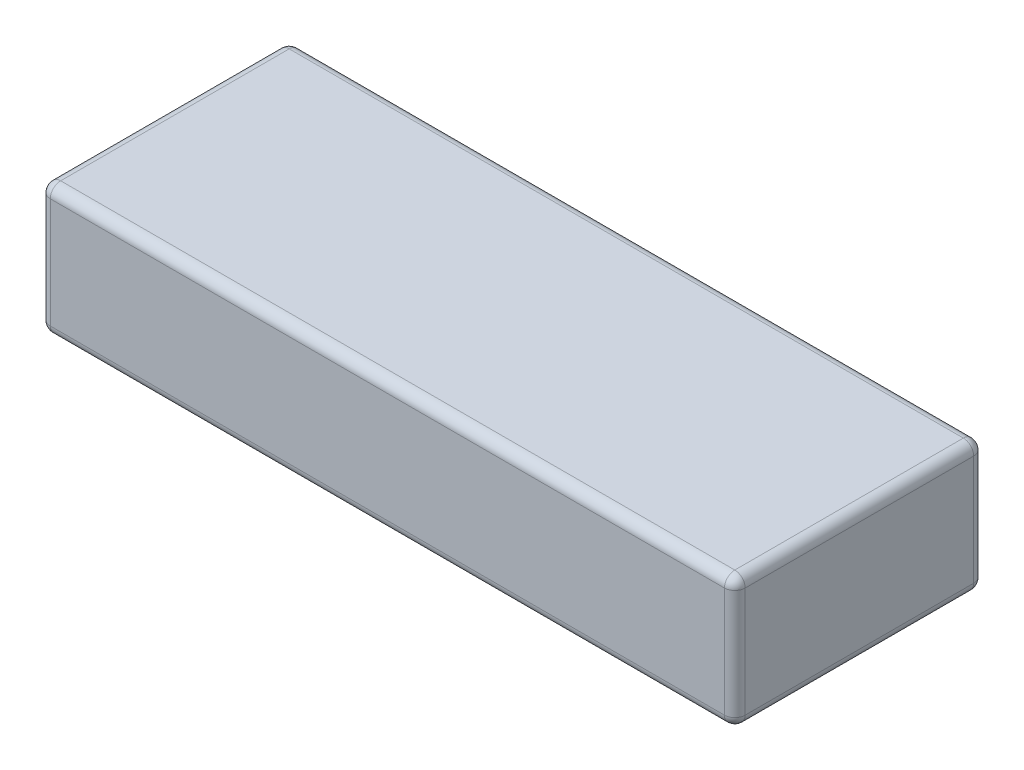
ISO-10303-21;
HEADER;
FILE_DESCRIPTION(('STEP AP214'),'2;1');
FILE_NAME('part.step','',(''),(''),'','','');
FILE_SCHEMA(('AUTOMOTIVE_DESIGN { 1 0 10303 214 1 1 1 1 }'));
ENDSEC;
DATA;
#1=APPLICATION_CONTEXT('core data for automotive mechanical design processes');
#2=APPLICATION_PROTOCOL_DEFINITION('international standard','automotive_design',2000,#1);
#3=PRODUCT_CONTEXT('',#1,'mechanical');
#4=PRODUCT('Part','Part','',(#3));
#5=PRODUCT_RELATED_PRODUCT_CATEGORY('part','',(#4));
#6=PRODUCT_DEFINITION_FORMATION('','',#4);
#7=PRODUCT_DEFINITION_CONTEXT('part definition',#1,'design');
#8=PRODUCT_DEFINITION('design','',#6,#7);
#9=PRODUCT_DEFINITION_SHAPE('','',#8);
#10=(LENGTH_UNIT() NAMED_UNIT(*) SI_UNIT(.MILLI.,.METRE.));
#11=(NAMED_UNIT(*) PLANE_ANGLE_UNIT() SI_UNIT($,.RADIAN.));
#12=(NAMED_UNIT(*) SI_UNIT($,.STERADIAN.) SOLID_ANGLE_UNIT());
#13=UNCERTAINTY_MEASURE_WITH_UNIT(LENGTH_MEASURE(1.E-05),#10,'distance_accuracy_value','');
#14=(GEOMETRIC_REPRESENTATION_CONTEXT(3) GLOBAL_UNCERTAINTY_ASSIGNED_CONTEXT((#13)) GLOBAL_UNIT_ASSIGNED_CONTEXT((#10,
#11,#12)) REPRESENTATION_CONTEXT('',''));
#15=CARTESIAN_POINT('',(0.,0.,0.));
#16=DIRECTION('',(0.,0.,1.));
#17=DIRECTION('',(1.,0.,0.));
#18=AXIS2_PLACEMENT_3D('',#15,#16,#17);
#19=CARTESIAN_POINT('',(84.963,32.004,-30.48));
#20=DIRECTION('',(-1.,0.,0.));
#21=DIRECTION('',(0.,0.,1.));
#22=AXIS2_PLACEMENT_3D('',#19,#20,#21);
#23=PLANE('',#22);
#24=DIRECTION('',(0.,-1.,0.));
#25=VECTOR('',#24,1.);
#26=CARTESIAN_POINT('',(84.963,32.004,27.94));
#27=LINE('',#26,#25);
#28=CARTESIAN_POINT('',(84.963,29.464,27.94));
#29=VERTEX_POINT('',#28);
#30=CARTESIAN_POINT('',(84.963,2.54,27.94));
#31=VERTEX_POINT('',#30);
#32=EDGE_CURVE('E218',#29,#31,#27,.T.);
#33=ORIENTED_EDGE('',*,*,#32,.T.);
#34=DIRECTION('',(0.,0.,-1.));
#35=VECTOR('',#34,1.);
#36=CARTESIAN_POINT('',(84.963,2.54,-30.48));
#37=LINE('',#36,#35);
#38=CARTESIAN_POINT('',(84.963,2.54,-27.94));
#39=VERTEX_POINT('',#38);
#40=EDGE_CURVE('E225',#31,#39,#37,.T.);
#41=ORIENTED_EDGE('',*,*,#40,.T.);
#42=DIRECTION('',(0.,-1.,0.));
#43=VECTOR('',#42,1.);
#44=CARTESIAN_POINT('',(84.963,32.004,-27.94));
#45=LINE('',#44,#43);
#46=CARTESIAN_POINT('',(84.963,29.464,-27.94));
#47=VERTEX_POINT('',#46);
#48=EDGE_CURVE('E222',#39,#47,#45,.F.);
#49=ORIENTED_EDGE('',*,*,#48,.T.);
#50=DIRECTION('',(0.,0.,-1.));
#51=VECTOR('',#50,1.);
#52=CARTESIAN_POINT('',(84.963,29.464,30.48));
#53=LINE('',#52,#51);
#54=EDGE_CURVE('E223',#47,#29,#53,.F.);
#55=ORIENTED_EDGE('',*,*,#54,.T.);
#56=EDGE_LOOP('',(#33,#41,#49,#55));
#57=FACE_BOUND('',#56,.T.);
#58=ADVANCED_FACE('F38',(#57),#23,.F.);
#59=CARTESIAN_POINT('',(-84.963,32.004,-30.48));
#60=DIRECTION('',(0.,0.,1.));
#61=DIRECTION('',(1.,0.,0.));
#62=AXIS2_PLACEMENT_3D('',#59,#60,#61);
#63=PLANE('',#62);
#64=DIRECTION('',(0.,-1.,0.));
#65=VECTOR('',#64,1.);
#66=CARTESIAN_POINT('',(82.423,32.004,-30.48));
#67=LINE('',#66,#65);
#68=CARTESIAN_POINT('',(82.423,29.464,-30.48));
#69=VERTEX_POINT('',#68);
#70=CARTESIAN_POINT('',(82.423,2.54,-30.48));
#71=VERTEX_POINT('',#70);
#72=EDGE_CURVE('E136',#69,#71,#67,.T.);
#73=ORIENTED_EDGE('',*,*,#72,.T.);
#74=DIRECTION('',(-1.,0.,0.));
#75=VECTOR('',#74,1.);
#76=CARTESIAN_POINT('',(-84.963,2.54,-30.48));
#77=LINE('',#76,#75);
#78=CARTESIAN_POINT('',(-82.423,2.54,-30.48));
#79=VERTEX_POINT('',#78);
#80=EDGE_CURVE('E132',#71,#79,#77,.T.);
#81=ORIENTED_EDGE('',*,*,#80,.T.);
#82=DIRECTION('',(0.,-1.,0.));
#83=VECTOR('',#82,1.);
#84=CARTESIAN_POINT('',(-82.423,32.004,-30.48));
#85=LINE('',#84,#83);
#86=CARTESIAN_POINT('',(-82.423,29.464,-30.48));
#87=VERTEX_POINT('',#86);
#88=EDGE_CURVE('E126',#79,#87,#85,.F.);
#89=ORIENTED_EDGE('',*,*,#88,.T.);
#90=DIRECTION('',(-1.,0.,0.));
#91=VECTOR('',#90,1.);
#92=CARTESIAN_POINT('',(84.963,29.464,-30.48));
#93=LINE('',#92,#91);
#94=EDGE_CURVE('E129',#87,#69,#93,.F.);
#95=ORIENTED_EDGE('',*,*,#94,.T.);
#96=EDGE_LOOP('',(#73,#81,#89,#95));
#97=FACE_BOUND('',#96,.T.);
#98=ADVANCED_FACE('F128',(#97),#63,.F.);
#99=CARTESIAN_POINT('',(-84.963,32.004,-30.48));
#100=DIRECTION('',(1.,0.,0.));
#101=DIRECTION('',(0.,0.,-1.));
#102=AXIS2_PLACEMENT_3D('',#99,#100,#101);
#103=PLANE('',#102);
#104=DIRECTION('',(0.,-1.,0.));
#105=VECTOR('',#104,1.);
#106=CARTESIAN_POINT('',(-84.963,32.004,-27.94));
#107=LINE('',#106,#105);
#108=CARTESIAN_POINT('',(-84.963,29.464,-27.94));
#109=VERTEX_POINT('',#108);
#110=CARTESIAN_POINT('',(-84.963,2.54,-27.94));
#111=VERTEX_POINT('',#110);
#112=EDGE_CURVE('E157',#109,#111,#107,.T.);
#113=ORIENTED_EDGE('',*,*,#112,.T.);
#114=DIRECTION('',(0.,0.,1.));
#115=VECTOR('',#114,1.);
#116=CARTESIAN_POINT('',(-84.963,2.54,-30.48));
#117=LINE('',#116,#115);
#118=CARTESIAN_POINT('',(-84.963,2.54,27.94));
#119=VERTEX_POINT('',#118);
#120=EDGE_CURVE('E281',#111,#119,#117,.T.);
#121=ORIENTED_EDGE('',*,*,#120,.T.);
#122=DIRECTION('',(0.,-1.,0.));
#123=VECTOR('',#122,1.);
#124=CARTESIAN_POINT('',(-84.963,32.004,27.94));
#125=LINE('',#124,#123);
#126=CARTESIAN_POINT('',(-84.963,29.464,27.94));
#127=VERTEX_POINT('',#126);
#128=EDGE_CURVE('E274',#119,#127,#125,.F.);
#129=ORIENTED_EDGE('',*,*,#128,.T.);
#130=DIRECTION('',(0.,0.,1.));
#131=VECTOR('',#130,1.);
#132=CARTESIAN_POINT('',(-84.963,29.464,-30.48));
#133=LINE('',#132,#131);
#134=EDGE_CURVE('E272',#127,#109,#133,.F.);
#135=ORIENTED_EDGE('',*,*,#134,.T.);
#136=EDGE_LOOP('',(#113,#121,#129,#135));
#137=FACE_BOUND('',#136,.T.);
#138=ADVANCED_FACE('F330',(#137),#103,.F.);
#139=CARTESIAN_POINT('',(-84.963,32.004,30.48));
#140=DIRECTION('',(0.,0.,-1.));
#141=DIRECTION('',(-1.,0.,0.));
#142=AXIS2_PLACEMENT_3D('',#139,#140,#141);
#143=PLANE('',#142);
#144=DIRECTION('',(1.,0.,0.));
#145=VECTOR('',#144,1.);
#146=CARTESIAN_POINT('',(-84.963,29.464,30.48));
#147=LINE('',#146,#145);
#148=CARTESIAN_POINT('',(82.423,29.464,30.48));
#149=VERTEX_POINT('',#148);
#150=CARTESIAN_POINT('',(-82.423,29.464,30.48));
#151=VERTEX_POINT('',#150);
#152=EDGE_CURVE('E284',#149,#151,#147,.F.);
#153=ORIENTED_EDGE('',*,*,#152,.T.);
#154=DIRECTION('',(0.,-1.,0.));
#155=VECTOR('',#154,1.);
#156=CARTESIAN_POINT('',(-82.423,32.004,30.48));
#157=LINE('',#156,#155);
#158=CARTESIAN_POINT('',(-82.423,2.54,30.48));
#159=VERTEX_POINT('',#158);
#160=EDGE_CURVE('E227',#151,#159,#157,.T.);
#161=ORIENTED_EDGE('',*,*,#160,.T.);
#162=DIRECTION('',(1.,0.,0.));
#163=VECTOR('',#162,1.);
#164=CARTESIAN_POINT('',(-84.963,2.54,30.48));
#165=LINE('',#164,#163);
#166=CARTESIAN_POINT('',(82.423,2.54,30.48));
#167=VERTEX_POINT('',#166);
#168=EDGE_CURVE('E287',#159,#167,#165,.T.);
#169=ORIENTED_EDGE('',*,*,#168,.T.);
#170=DIRECTION('',(0.,-1.,0.));
#171=VECTOR('',#170,1.);
#172=CARTESIAN_POINT('',(82.423,32.004,30.48));
#173=LINE('',#172,#171);
#174=EDGE_CURVE('E216',#167,#149,#173,.F.);
#175=ORIENTED_EDGE('',*,*,#174,.T.);
#176=EDGE_LOOP('',(#153,#161,#169,#175));
#177=FACE_BOUND('',#176,.T.);
#178=ADVANCED_FACE('F291',(#177),#143,.F.);
#179=CARTESIAN_POINT('',(0.,32.004,0.));
#180=DIRECTION('',(0.,1.,0.));
#181=DIRECTION('',(0.,0.,1.));
#182=AXIS2_PLACEMENT_3D('',#179,#180,#181);
#183=PLANE('',#182);
#184=DIRECTION('',(0.,0.,1.));
#185=VECTOR('',#184,1.);
#186=CARTESIAN_POINT('',(-82.423,32.004,30.48));
#187=LINE('',#186,#185);
#188=CARTESIAN_POINT('',(-82.423,32.004,-27.94));
#189=VERTEX_POINT('',#188);
#190=CARTESIAN_POINT('',(-82.423,32.004,27.94));
#191=VERTEX_POINT('',#190);
#192=EDGE_CURVE('E58',#189,#191,#187,.T.);
#193=ORIENTED_EDGE('',*,*,#192,.T.);
#194=DIRECTION('',(1.,0.,0.));
#195=VECTOR('',#194,1.);
#196=CARTESIAN_POINT('',(84.963,32.004,27.94));
#197=LINE('',#196,#195);
#198=CARTESIAN_POINT('',(82.423,32.004,27.94));
#199=VERTEX_POINT('',#198);
#200=EDGE_CURVE('E11',#191,#199,#197,.T.);
#201=ORIENTED_EDGE('',*,*,#200,.T.);
#202=DIRECTION('',(0.,0.,-1.));
#203=VECTOR('',#202,1.);
#204=CARTESIAN_POINT('',(82.423,32.004,-30.48));
#205=LINE('',#204,#203);
#206=CARTESIAN_POINT('',(82.423,32.004,-27.94));
#207=VERTEX_POINT('',#206);
#208=EDGE_CURVE('E47',#199,#207,#205,.T.);
#209=ORIENTED_EDGE('',*,*,#208,.T.);
#210=DIRECTION('',(-1.,0.,0.));
#211=VECTOR('',#210,1.);
#212=CARTESIAN_POINT('',(-84.963,32.004,-27.94));
#213=LINE('',#212,#211);
#214=EDGE_CURVE('E232',#207,#189,#213,.T.);
#215=ORIENTED_EDGE('',*,*,#214,.T.);
#216=EDGE_LOOP('',(#193,#201,#209,#215));
#217=FACE_BOUND('',#216,.T.);
#218=ADVANCED_FACE('F382',(#217),#183,.T.);
#219=CARTESIAN_POINT('',(0.,0.,0.));
#220=DIRECTION('',(0.,1.,0.));
#221=DIRECTION('',(0.,0.,1.));
#222=AXIS2_PLACEMENT_3D('',#219,#220,#221);
#223=PLANE('',#222);
#224=DIRECTION('',(0.,0.,1.));
#225=VECTOR('',#224,1.);
#226=CARTESIAN_POINT('',(-82.423,0.,0.));
#227=LINE('',#226,#225);
#228=CARTESIAN_POINT('',(-82.423,0.,27.94));
#229=VERTEX_POINT('',#228);
#230=CARTESIAN_POINT('',(-82.423,0.,-27.94));
#231=VERTEX_POINT('',#230);
#232=EDGE_CURVE('E268',#229,#231,#227,.F.);
#233=ORIENTED_EDGE('',*,*,#232,.T.);
#234=DIRECTION('',(-1.,0.,0.));
#235=VECTOR('',#234,1.);
#236=CARTESIAN_POINT('',(0.,0.,-27.94));
#237=LINE('',#236,#235);
#238=CARTESIAN_POINT('',(82.423,0.,-27.94));
#239=VERTEX_POINT('',#238);
#240=EDGE_CURVE('E265',#231,#239,#237,.F.);
#241=ORIENTED_EDGE('',*,*,#240,.T.);
#242=DIRECTION('',(0.,0.,-1.));
#243=VECTOR('',#242,1.);
#244=CARTESIAN_POINT('',(82.423,0.,0.));
#245=LINE('',#244,#243);
#246=CARTESIAN_POINT('',(82.423,0.,27.94));
#247=VERTEX_POINT('',#246);
#248=EDGE_CURVE('E257',#239,#247,#245,.F.);
#249=ORIENTED_EDGE('',*,*,#248,.T.);
#250=DIRECTION('',(1.,0.,0.));
#251=VECTOR('',#250,1.);
#252=CARTESIAN_POINT('',(0.,0.,27.94));
#253=LINE('',#252,#251);
#254=EDGE_CURVE('E262',#247,#229,#253,.F.);
#255=ORIENTED_EDGE('',*,*,#254,.T.);
#256=EDGE_LOOP('',(#233,#241,#249,#255));
#257=FACE_BOUND('',#256,.T.);
#258=ADVANCED_FACE('F266',(#257),#223,.F.);
#259=CARTESIAN_POINT('',(0.,29.464,27.94));
#260=DIRECTION('',(-1.,0.,0.));
#261=DIRECTION('',(0.,0.,1.));
#262=AXIS2_PLACEMENT_3D('',#259,#260,#261);
#263=CYLINDRICAL_SURFACE('',#262,2.54);
#264=CARTESIAN_POINT('',(82.423,29.464,27.94));
#265=DIRECTION('',(1.,0.,0.));
#266=DIRECTION('',(0.,0.,-1.));
#267=AXIS2_PLACEMENT_3D('',#264,#265,#266);
#268=CIRCLE('',#267,2.54);
#269=EDGE_CURVE('E42',#199,#149,#268,.T.);
#270=ORIENTED_EDGE('',*,*,#269,.F.);
#271=ORIENTED_EDGE('',*,*,#200,.F.);
#272=CARTESIAN_POINT('',(-82.423,29.464,27.94));
#273=DIRECTION('',(-1.,0.,0.));
#274=DIRECTION('',(0.,0.,1.));
#275=AXIS2_PLACEMENT_3D('',#272,#273,#274);
#276=CIRCLE('',#275,2.54);
#277=EDGE_CURVE('E197',#151,#191,#276,.T.);
#278=ORIENTED_EDGE('',*,*,#277,.F.);
#279=ORIENTED_EDGE('',*,*,#152,.F.);
#280=EDGE_LOOP('',(#270,#271,#278,#279));
#281=FACE_BOUND('',#280,.T.);
#282=ADVANCED_FACE('F40',(#281),#263,.T.);
#283=CARTESIAN_POINT('',(82.423,29.464,27.94));
#284=DIRECTION('',(0.,0.,1.));
#285=DIRECTION('',(1.,0.,0.));
#286=AXIS2_PLACEMENT_3D('',#283,#284,#285);
#287=SPHERICAL_SURFACE('',#286,2.54);
#288=CARTESIAN_POINT('',(82.423,29.464,27.94));
#289=DIRECTION('',(0.,0.,1.));
#290=DIRECTION('',(0.,-1.,0.));
#291=AXIS2_PLACEMENT_3D('',#288,#289,#290);
#292=CIRCLE('',#291,2.54);
#293=EDGE_CURVE('E192',#199,#29,#292,.F.);
#294=ORIENTED_EDGE('',*,*,#293,.F.);
#295=ORIENTED_EDGE('',*,*,#269,.T.);
#296=CARTESIAN_POINT('',(82.423,29.464,27.94));
#297=DIRECTION('',(0.,1.,0.));
#298=DIRECTION('',(0.,0.,1.));
#299=AXIS2_PLACEMENT_3D('',#296,#297,#298);
#300=CIRCLE('',#299,2.54);
#301=EDGE_CURVE('E195',#29,#149,#300,.F.);
#302=ORIENTED_EDGE('',*,*,#301,.F.);
#303=EDGE_LOOP('',(#294,#295,#302));
#304=FACE_BOUND('',#303,.T.);
#305=ADVANCED_FACE('F207',(#304),#287,.T.);
#306=CARTESIAN_POINT('',(-82.423,29.464,27.94));
#307=DIRECTION('',(0.,0.,1.));
#308=DIRECTION('',(1.,0.,0.));
#309=AXIS2_PLACEMENT_3D('',#306,#307,#308);
#310=SPHERICAL_SURFACE('',#309,2.54);
#311=CARTESIAN_POINT('',(-82.423,29.464,27.94));
#312=DIRECTION('',(0.,1.,0.));
#313=DIRECTION('',(0.,0.,1.));
#314=AXIS2_PLACEMENT_3D('',#311,#312,#313);
#315=CIRCLE('',#314,2.54);
#316=EDGE_CURVE('E186',#151,#127,#315,.F.);
#317=ORIENTED_EDGE('',*,*,#316,.F.);
#318=ORIENTED_EDGE('',*,*,#277,.T.);
#319=CARTESIAN_POINT('',(-82.423,29.464,27.94));
#320=DIRECTION('',(0.,0.,1.));
#321=DIRECTION('',(1.,0.,0.));
#322=AXIS2_PLACEMENT_3D('',#319,#320,#321);
#323=CIRCLE('',#322,2.54);
#324=EDGE_CURVE('E189',#127,#191,#323,.F.);
#325=ORIENTED_EDGE('',*,*,#324,.F.);
#326=EDGE_LOOP('',(#317,#318,#325));
#327=FACE_BOUND('',#326,.T.);
#328=ADVANCED_FACE('F373',(#327),#310,.T.);
#329=CARTESIAN_POINT('',(82.423,32.004,27.94));
#330=DIRECTION('',(0.,-1.,0.));
#331=DIRECTION('',(0.,0.,-1.));
#332=AXIS2_PLACEMENT_3D('',#329,#330,#331);
#333=CYLINDRICAL_SURFACE('',#332,2.54);
#334=ORIENTED_EDGE('',*,*,#301,.T.);
#335=ORIENTED_EDGE('',*,*,#174,.F.);
#336=CARTESIAN_POINT('',(82.423,2.54,27.94));
#337=DIRECTION('',(0.,-1.,0.));
#338=DIRECTION('',(0.,0.,-1.));
#339=AXIS2_PLACEMENT_3D('',#336,#337,#338);
#340=CIRCLE('',#339,2.54);
#341=EDGE_CURVE('E180',#31,#167,#340,.T.);
#342=ORIENTED_EDGE('',*,*,#341,.F.);
#343=ORIENTED_EDGE('',*,*,#32,.F.);
#344=EDGE_LOOP('',(#334,#335,#342,#343));
#345=FACE_BOUND('',#344,.T.);
#346=ADVANCED_FACE('F214',(#345),#333,.T.);
#347=CARTESIAN_POINT('',(82.423,29.464,0.));
#348=DIRECTION('',(0.,0.,1.));
#349=DIRECTION('',(1.,0.,0.));
#350=AXIS2_PLACEMENT_3D('',#347,#348,#349);
#351=CYLINDRICAL_SURFACE('',#350,2.54);
#352=ORIENTED_EDGE('',*,*,#293,.T.);
#353=ORIENTED_EDGE('',*,*,#54,.F.);
#354=CARTESIAN_POINT('',(82.423,29.464,-27.94));
#355=DIRECTION('',(0.,0.,-1.));
#356=DIRECTION('',(-1.,0.,0.));
#357=AXIS2_PLACEMENT_3D('',#354,#355,#356);
#358=CIRCLE('',#357,2.54);
#359=EDGE_CURVE('E177',#207,#47,#358,.T.);
#360=ORIENTED_EDGE('',*,*,#359,.F.);
#361=ORIENTED_EDGE('',*,*,#208,.F.);
#362=EDGE_LOOP('',(#352,#353,#360,#361));
#363=FACE_BOUND('',#362,.T.);
#364=ADVANCED_FACE('F308',(#363),#351,.T.);
#365=CARTESIAN_POINT('',(0.,29.464,-27.94));
#366=DIRECTION('',(1.,0.,0.));
#367=DIRECTION('',(0.,0.,-1.));
#368=AXIS2_PLACEMENT_3D('',#365,#366,#367);
#369=CYLINDRICAL_SURFACE('',#368,2.54);
#370=CARTESIAN_POINT('',(-82.423,29.464,-27.94));
#371=DIRECTION('',(-1.,0.,0.));
#372=DIRECTION('',(0.,0.,1.));
#373=AXIS2_PLACEMENT_3D('',#370,#371,#372);
#374=CIRCLE('',#373,2.54);
#375=EDGE_CURVE('E143',#189,#87,#374,.T.);
#376=ORIENTED_EDGE('',*,*,#375,.F.);
#377=ORIENTED_EDGE('',*,*,#214,.F.);
#378=CARTESIAN_POINT('',(82.423,29.464,-27.94));
#379=DIRECTION('',(1.,0.,0.));
#380=DIRECTION('',(0.,1.,0.));
#381=AXIS2_PLACEMENT_3D('',#378,#379,#380);
#382=CIRCLE('',#381,2.54);
#383=EDGE_CURVE('E145',#69,#207,#382,.T.);
#384=ORIENTED_EDGE('',*,*,#383,.F.);
#385=ORIENTED_EDGE('',*,*,#94,.F.);
#386=EDGE_LOOP('',(#376,#377,#384,#385));
#387=FACE_BOUND('',#386,.T.);
#388=ADVANCED_FACE('F141',(#387),#369,.T.);
#389=CARTESIAN_POINT('',(-82.423,29.464,0.));
#390=DIRECTION('',(0.,0.,-1.));
#391=DIRECTION('',(-1.,0.,0.));
#392=AXIS2_PLACEMENT_3D('',#389,#390,#391);
#393=CYLINDRICAL_SURFACE('',#392,2.54);
#394=ORIENTED_EDGE('',*,*,#324,.T.);
#395=ORIENTED_EDGE('',*,*,#192,.F.);
#396=CARTESIAN_POINT('',(-82.423,29.464,-27.94));
#397=DIRECTION('',(0.,0.,-1.));
#398=DIRECTION('',(-1.,0.,0.));
#399=AXIS2_PLACEMENT_3D('',#396,#397,#398);
#400=CIRCLE('',#399,2.54);
#401=EDGE_CURVE('E154',#109,#189,#400,.T.);
#402=ORIENTED_EDGE('',*,*,#401,.F.);
#403=ORIENTED_EDGE('',*,*,#134,.F.);
#404=EDGE_LOOP('',(#394,#395,#402,#403));
#405=FACE_BOUND('',#404,.T.);
#406=ADVANCED_FACE('F363',(#405),#393,.T.);
#407=CARTESIAN_POINT('',(-82.423,32.004,27.94));
#408=DIRECTION('',(0.,-1.,0.));
#409=DIRECTION('',(0.,0.,-1.));
#410=AXIS2_PLACEMENT_3D('',#407,#408,#409);
#411=CYLINDRICAL_SURFACE('',#410,2.54);
#412=ORIENTED_EDGE('',*,*,#316,.T.);
#413=ORIENTED_EDGE('',*,*,#128,.F.);
#414=CARTESIAN_POINT('',(-82.423,2.54,27.94));
#415=DIRECTION('',(0.,-1.,0.));
#416=DIRECTION('',(0.,0.,-1.));
#417=AXIS2_PLACEMENT_3D('',#414,#415,#416);
#418=CIRCLE('',#417,2.54);
#419=EDGE_CURVE('E172',#159,#119,#418,.T.);
#420=ORIENTED_EDGE('',*,*,#419,.F.);
#421=ORIENTED_EDGE('',*,*,#160,.F.);
#422=EDGE_LOOP('',(#412,#413,#420,#421));
#423=FACE_BOUND('',#422,.T.);
#424=ADVANCED_FACE('F295',(#423),#411,.T.);
#425=CARTESIAN_POINT('',(-84.963,2.54,27.94));
#426=DIRECTION('',(1.,0.,0.));
#427=DIRECTION('',(0.,0.,-1.));
#428=AXIS2_PLACEMENT_3D('',#425,#426,#427);
#429=CYLINDRICAL_SURFACE('',#428,2.54);
#430=CARTESIAN_POINT('',(82.423,2.54,27.94));
#431=DIRECTION('',(1.,0.,0.));
#432=DIRECTION('',(0.,0.,-1.));
#433=AXIS2_PLACEMENT_3D('',#430,#431,#432);
#434=CIRCLE('',#433,2.54);
#435=EDGE_CURVE('E183',#167,#247,#434,.T.);
#436=ORIENTED_EDGE('',*,*,#435,.F.);
#437=ORIENTED_EDGE('',*,*,#168,.F.);
#438=CARTESIAN_POINT('',(-82.423,2.54,27.94));
#439=DIRECTION('',(-1.,0.,0.));
#440=DIRECTION('',(0.,0.,1.));
#441=AXIS2_PLACEMENT_3D('',#438,#439,#440);
#442=CIRCLE('',#441,2.54);
#443=EDGE_CURVE('E170',#229,#159,#442,.T.);
#444=ORIENTED_EDGE('',*,*,#443,.F.);
#445=ORIENTED_EDGE('',*,*,#254,.F.);
#446=EDGE_LOOP('',(#436,#437,#444,#445));
#447=FACE_BOUND('',#446,.T.);
#448=ADVANCED_FACE('F301',(#447),#429,.T.);
#449=CARTESIAN_POINT('',(82.423,2.54,27.94));
#450=DIRECTION('',(0.,0.,1.));
#451=DIRECTION('',(1.,0.,0.));
#452=AXIS2_PLACEMENT_3D('',#449,#450,#451);
#453=SPHERICAL_SURFACE('',#452,2.54);
#454=ORIENTED_EDGE('',*,*,#341,.T.);
#455=ORIENTED_EDGE('',*,*,#435,.T.);
#456=CARTESIAN_POINT('',(82.423,2.54,27.94));
#457=DIRECTION('',(0.,0.,1.));
#458=DIRECTION('',(1.,0.,0.));
#459=AXIS2_PLACEMENT_3D('',#456,#457,#458);
#460=CIRCLE('',#459,2.54);
#461=EDGE_CURVE('E162',#31,#247,#460,.F.);
#462=ORIENTED_EDGE('',*,*,#461,.F.);
#463=EDGE_LOOP('',(#454,#455,#462));
#464=FACE_BOUND('',#463,.T.);
#465=ADVANCED_FACE('F303',(#464),#453,.T.);
#466=CARTESIAN_POINT('',(82.423,29.464,-27.94));
#467=DIRECTION('',(0.,0.,1.));
#468=DIRECTION('',(1.,0.,0.));
#469=AXIS2_PLACEMENT_3D('',#466,#467,#468);
#470=SPHERICAL_SURFACE('',#469,2.54);
#471=ORIENTED_EDGE('',*,*,#383,.T.);
#472=ORIENTED_EDGE('',*,*,#359,.T.);
#473=CARTESIAN_POINT('',(82.423,29.464,-27.94));
#474=DIRECTION('',(0.,1.,0.));
#475=DIRECTION('',(0.,0.,1.));
#476=AXIS2_PLACEMENT_3D('',#473,#474,#475);
#477=CIRCLE('',#476,2.54);
#478=EDGE_CURVE('E158',#69,#47,#477,.F.);
#479=ORIENTED_EDGE('',*,*,#478,.F.);
#480=EDGE_LOOP('',(#471,#472,#479));
#481=FACE_BOUND('',#480,.T.);
#482=ADVANCED_FACE('F310',(#481),#470,.T.);
#483=CARTESIAN_POINT('',(-82.423,29.464,-27.94));
#484=DIRECTION('',(0.,0.,1.));
#485=DIRECTION('',(1.,0.,0.));
#486=AXIS2_PLACEMENT_3D('',#483,#484,#485);
#487=SPHERICAL_SURFACE('',#486,2.54);
#488=ORIENTED_EDGE('',*,*,#401,.T.);
#489=ORIENTED_EDGE('',*,*,#375,.T.);
#490=CARTESIAN_POINT('',(-82.423,29.464,-27.94));
#491=DIRECTION('',(0.,1.,0.));
#492=DIRECTION('',(0.,0.,1.));
#493=AXIS2_PLACEMENT_3D('',#490,#491,#492);
#494=CIRCLE('',#493,2.54);
#495=EDGE_CURVE('E151',#109,#87,#494,.F.);
#496=ORIENTED_EDGE('',*,*,#495,.F.);
#497=EDGE_LOOP('',(#488,#489,#496));
#498=FACE_BOUND('',#497,.T.);
#499=ADVANCED_FACE('F150',(#498),#487,.T.);
#500=CARTESIAN_POINT('',(-82.423,2.54,27.94));
#501=DIRECTION('',(0.,0.,1.));
#502=DIRECTION('',(1.,0.,0.));
#503=AXIS2_PLACEMENT_3D('',#500,#501,#502);
#504=SPHERICAL_SURFACE('',#503,2.54);
#505=ORIENTED_EDGE('',*,*,#443,.T.);
#506=ORIENTED_EDGE('',*,*,#419,.T.);
#507=CARTESIAN_POINT('',(-82.423,2.54,27.94));
#508=DIRECTION('',(0.,0.,1.));
#509=DIRECTION('',(1.,0.,0.));
#510=AXIS2_PLACEMENT_3D('',#507,#508,#509);
#511=CIRCLE('',#510,2.54);
#512=EDGE_CURVE('E159',#229,#119,#511,.F.);
#513=ORIENTED_EDGE('',*,*,#512,.F.);
#514=EDGE_LOOP('',(#505,#506,#513));
#515=FACE_BOUND('',#514,.T.);
#516=ADVANCED_FACE('F323',(#515),#504,.T.);
#517=CARTESIAN_POINT('',(82.423,2.54,-30.48));
#518=DIRECTION('',(0.,0.,-1.));
#519=DIRECTION('',(-1.,0.,0.));
#520=AXIS2_PLACEMENT_3D('',#517,#518,#519);
#521=CYLINDRICAL_SURFACE('',#520,2.54);
#522=ORIENTED_EDGE('',*,*,#461,.T.);
#523=ORIENTED_EDGE('',*,*,#248,.F.);
#524=CARTESIAN_POINT('',(82.423,2.54,-27.94));
#525=DIRECTION('',(0.,0.,-1.));
#526=DIRECTION('',(-1.,0.,0.));
#527=AXIS2_PLACEMENT_3D('',#524,#525,#526);
#528=CIRCLE('',#527,2.54);
#529=EDGE_CURVE('E164',#39,#239,#528,.T.);
#530=ORIENTED_EDGE('',*,*,#529,.F.);
#531=ORIENTED_EDGE('',*,*,#40,.F.);
#532=EDGE_LOOP('',(#522,#523,#530,#531));
#533=FACE_BOUND('',#532,.T.);
#534=ADVANCED_FACE('F259',(#533),#521,.T.);
#535=CARTESIAN_POINT('',(82.423,32.004,-27.94));
#536=DIRECTION('',(0.,-1.,0.));
#537=DIRECTION('',(0.,0.,-1.));
#538=AXIS2_PLACEMENT_3D('',#535,#536,#537);
#539=CYLINDRICAL_SURFACE('',#538,2.54);
#540=ORIENTED_EDGE('',*,*,#478,.T.);
#541=ORIENTED_EDGE('',*,*,#48,.F.);
#542=CARTESIAN_POINT('',(82.423,2.54,-27.94));
#543=DIRECTION('',(0.,-1.,0.));
#544=DIRECTION('',(0.,0.,-1.));
#545=AXIS2_PLACEMENT_3D('',#542,#543,#544);
#546=CIRCLE('',#545,2.54);
#547=EDGE_CURVE('E246',#71,#39,#546,.T.);
#548=ORIENTED_EDGE('',*,*,#547,.F.);
#549=ORIENTED_EDGE('',*,*,#72,.F.);
#550=EDGE_LOOP('',(#540,#541,#548,#549));
#551=FACE_BOUND('',#550,.T.);
#552=ADVANCED_FACE('F312',(#551),#539,.T.);
#553=CARTESIAN_POINT('',(-82.423,32.004,-27.94));
#554=DIRECTION('',(0.,-1.,0.));
#555=DIRECTION('',(0.,0.,-1.));
#556=AXIS2_PLACEMENT_3D('',#553,#554,#555);
#557=CYLINDRICAL_SURFACE('',#556,2.54);
#558=ORIENTED_EDGE('',*,*,#495,.T.);
#559=ORIENTED_EDGE('',*,*,#88,.F.);
#560=CARTESIAN_POINT('',(-82.423,2.54,-27.94));
#561=DIRECTION('',(0.,-1.,0.));
#562=DIRECTION('',(0.,0.,-1.));
#563=AXIS2_PLACEMENT_3D('',#560,#561,#562);
#564=CIRCLE('',#563,2.54);
#565=EDGE_CURVE('E243',#111,#79,#564,.T.);
#566=ORIENTED_EDGE('',*,*,#565,.F.);
#567=ORIENTED_EDGE('',*,*,#112,.F.);
#568=EDGE_LOOP('',(#558,#559,#566,#567));
#569=FACE_BOUND('',#568,.T.);
#570=ADVANCED_FACE('F156',(#569),#557,.T.);
#571=CARTESIAN_POINT('',(-82.423,2.54,-30.48));
#572=DIRECTION('',(0.,0.,1.));
#573=DIRECTION('',(1.,0.,0.));
#574=AXIS2_PLACEMENT_3D('',#571,#572,#573);
#575=CYLINDRICAL_SURFACE('',#574,2.54);
#576=ORIENTED_EDGE('',*,*,#512,.T.);
#577=ORIENTED_EDGE('',*,*,#120,.F.);
#578=CARTESIAN_POINT('',(-82.423,2.54,-27.94));
#579=DIRECTION('',(0.,0.,-1.));
#580=DIRECTION('',(-1.,0.,0.));
#581=AXIS2_PLACEMENT_3D('',#578,#579,#580);
#582=CIRCLE('',#581,2.54);
#583=EDGE_CURVE('E240',#231,#111,#582,.T.);
#584=ORIENTED_EDGE('',*,*,#583,.F.);
#585=ORIENTED_EDGE('',*,*,#232,.F.);
#586=EDGE_LOOP('',(#576,#577,#584,#585));
#587=FACE_BOUND('',#586,.T.);
#588=ADVANCED_FACE('F321',(#587),#575,.T.);
#589=CARTESIAN_POINT('',(82.423,2.54,-27.94));
#590=DIRECTION('',(0.,0.,1.));
#591=DIRECTION('',(1.,0.,0.));
#592=AXIS2_PLACEMENT_3D('',#589,#590,#591);
#593=SPHERICAL_SURFACE('',#592,2.54);
#594=ORIENTED_EDGE('',*,*,#547,.T.);
#595=ORIENTED_EDGE('',*,*,#529,.T.);
#596=CARTESIAN_POINT('',(82.423,2.54,-27.94));
#597=DIRECTION('',(1.,0.,0.));
#598=DIRECTION('',(0.,0.,-1.));
#599=AXIS2_PLACEMENT_3D('',#596,#597,#598);
#600=CIRCLE('',#599,2.54);
#601=EDGE_CURVE('E238',#71,#239,#600,.F.);
#602=ORIENTED_EDGE('',*,*,#601,.F.);
#603=EDGE_LOOP('',(#594,#595,#602));
#604=FACE_BOUND('',#603,.T.);
#605=ADVANCED_FACE('F252',(#604),#593,.T.);
#606=CARTESIAN_POINT('',(-82.423,2.54,-27.94));
#607=DIRECTION('',(0.,0.,1.));
#608=DIRECTION('',(1.,0.,0.));
#609=AXIS2_PLACEMENT_3D('',#606,#607,#608);
#610=SPHERICAL_SURFACE('',#609,2.54);
#611=ORIENTED_EDGE('',*,*,#583,.T.);
#612=ORIENTED_EDGE('',*,*,#565,.T.);
#613=CARTESIAN_POINT('',(-82.423,2.54,-27.94));
#614=DIRECTION('',(-1.,0.,0.));
#615=DIRECTION('',(0.,0.,1.));
#616=AXIS2_PLACEMENT_3D('',#613,#614,#615);
#617=CIRCLE('',#616,2.54);
#618=EDGE_CURVE('E236',#231,#79,#617,.F.);
#619=ORIENTED_EDGE('',*,*,#618,.F.);
#620=EDGE_LOOP('',(#611,#612,#619));
#621=FACE_BOUND('',#620,.T.);
#622=ADVANCED_FACE('F337',(#621),#610,.T.);
#623=CARTESIAN_POINT('',(-84.963,2.54,-27.94));
#624=DIRECTION('',(-1.,0.,0.));
#625=DIRECTION('',(0.,0.,1.));
#626=AXIS2_PLACEMENT_3D('',#623,#624,#625);
#627=CYLINDRICAL_SURFACE('',#626,2.54);
#628=ORIENTED_EDGE('',*,*,#601,.T.);
#629=ORIENTED_EDGE('',*,*,#240,.F.);
#630=ORIENTED_EDGE('',*,*,#618,.T.);
#631=ORIENTED_EDGE('',*,*,#80,.F.);
#632=EDGE_LOOP('',(#628,#629,#630,#631));
#633=FACE_BOUND('',#632,.T.);
#634=ADVANCED_FACE('F334',(#633),#627,.T.);
#635=CLOSED_SHELL('',(#58,#98,#138,#178,#218,#258,#282,#305,#328,#346,#364,#388,#406,#424,#448,
#465,#482,#499,#516,#534,#552,#570,#588,#605,#622,#634));
#636=MANIFOLD_SOLID_BREP('B2',#635);
#637=ADVANCED_BREP_SHAPE_REPRESENTATION('',(#18,#636),#14);
#638=SHAPE_DEFINITION_REPRESENTATION(#9,#637);
ENDSEC;
END-ISO-10303-21;
